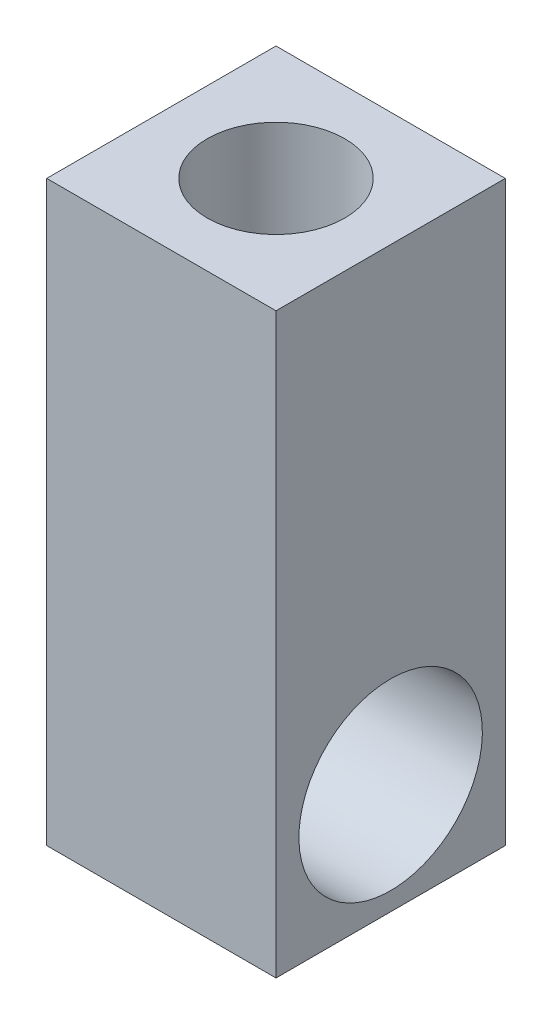
ISO-10303-21;
HEADER;
FILE_DESCRIPTION(('STEP AP214'),'2;1');
FILE_NAME('part.step','',(''),(''),'','','');
FILE_SCHEMA(('AUTOMOTIVE_DESIGN { 1 0 10303 214 1 1 1 1 }'));
ENDSEC;
DATA;
#1=APPLICATION_CONTEXT('core data for automotive mechanical design processes');
#2=APPLICATION_PROTOCOL_DEFINITION('international standard','automotive_design',2000,#1);
#3=PRODUCT_CONTEXT('',#1,'mechanical');
#4=PRODUCT('Part','Part','',(#3));
#5=PRODUCT_RELATED_PRODUCT_CATEGORY('part','',(#4));
#6=PRODUCT_DEFINITION_FORMATION('','',#4);
#7=PRODUCT_DEFINITION_CONTEXT('part definition',#1,'design');
#8=PRODUCT_DEFINITION('design','',#6,#7);
#9=PRODUCT_DEFINITION_SHAPE('','',#8);
#10=(LENGTH_UNIT() NAMED_UNIT(*) SI_UNIT(.MILLI.,.METRE.));
#11=(NAMED_UNIT(*) PLANE_ANGLE_UNIT() SI_UNIT($,.RADIAN.));
#12=(NAMED_UNIT(*) SI_UNIT($,.STERADIAN.) SOLID_ANGLE_UNIT());
#13=UNCERTAINTY_MEASURE_WITH_UNIT(LENGTH_MEASURE(1.E-05),#10,'distance_accuracy_value','');
#14=(GEOMETRIC_REPRESENTATION_CONTEXT(3) GLOBAL_UNCERTAINTY_ASSIGNED_CONTEXT((#13)) GLOBAL_UNIT_ASSIGNED_CONTEXT((#10,
#11,#12)) REPRESENTATION_CONTEXT('',''));
#15=CARTESIAN_POINT('',(0.,0.,0.));
#16=DIRECTION('',(0.,0.,1.));
#17=DIRECTION('',(1.,0.,0.));
#18=AXIS2_PLACEMENT_3D('',#15,#16,#17);
#19=CARTESIAN_POINT('',(0.,0.,0.));
#20=DIRECTION('',(0.,0.,1.));
#21=DIRECTION('',(1.,0.,0.));
#22=AXIS2_PLACEMENT_3D('',#19,#20,#21);
#23=PLANE('',#22);
#24=DIRECTION('',(0.,1.,0.));
#25=VECTOR('',#24,1.);
#26=CARTESIAN_POINT('',(1.25,5.,0.));
#27=LINE('',#26,#25);
#28=CARTESIAN_POINT('',(1.25,-4.3,0.));
#29=VERTEX_POINT('',#28);
#30=CARTESIAN_POINT('',(1.25,2.,0.));
#31=VERTEX_POINT('',#30);
#32=EDGE_CURVE('E169',#29,#31,#27,.T.);
#33=ORIENTED_EDGE('',*,*,#32,.F.);
#34=DIRECTION('',(1.,0.,0.));
#35=VECTOR('',#34,1.);
#36=CARTESIAN_POINT('',(-1.25,-4.3,0.));
#37=LINE('',#36,#35);
#38=CARTESIAN_POINT('',(-1.25,-4.3,0.));
#39=VERTEX_POINT('',#38);
#40=EDGE_CURVE('E101',#39,#29,#37,.T.);
#41=ORIENTED_EDGE('',*,*,#40,.F.);
#42=DIRECTION('',(0.,-1.,0.));
#43=VECTOR('',#42,1.);
#44=CARTESIAN_POINT('',(-1.25,5.,0.));
#45=LINE('',#44,#43);
#46=CARTESIAN_POINT('',(-1.25,2.,0.));
#47=VERTEX_POINT('',#46);
#48=EDGE_CURVE('E161',#47,#39,#45,.T.);
#49=ORIENTED_EDGE('',*,*,#48,.F.);
#50=DIRECTION('',(-1.,0.,0.));
#51=VECTOR('',#50,1.);
#52=CARTESIAN_POINT('',(-1.25,2.,0.));
#53=LINE('',#52,#51);
#54=EDGE_CURVE('E177',#31,#47,#53,.T.);
#55=ORIENTED_EDGE('',*,*,#54,.F.);
#56=EDGE_LOOP('',(#33,#41,#49,#55));
#57=FACE_BOUND('',#56,.T.);
#58=ADVANCED_FACE('F35',(#57),#23,.F.);
#59=CARTESIAN_POINT('',(0.,0.,2.5));
#60=DIRECTION('',(0.,0.,1.));
#61=DIRECTION('',(1.,0.,0.));
#62=AXIS2_PLACEMENT_3D('',#59,#60,#61);
#63=PLANE('',#62);
#64=DIRECTION('',(1.,0.,0.));
#65=VECTOR('',#64,1.);
#66=CARTESIAN_POINT('',(-1.25,-4.3,2.5));
#67=LINE('',#66,#65);
#68=CARTESIAN_POINT('',(-1.25,-4.3,2.5));
#69=VERTEX_POINT('',#68);
#70=CARTESIAN_POINT('',(1.25,-4.3,2.5));
#71=VERTEX_POINT('',#70);
#72=EDGE_CURVE('E96',#69,#71,#67,.T.);
#73=ORIENTED_EDGE('',*,*,#72,.T.);
#74=DIRECTION('',(0.,1.,0.));
#75=VECTOR('',#74,1.);
#76=CARTESIAN_POINT('',(1.25,5.,2.5));
#77=LINE('',#76,#75);
#78=CARTESIAN_POINT('',(1.25,2.,2.5));
#79=VERTEX_POINT('',#78);
#80=EDGE_CURVE('E168',#71,#79,#77,.T.);
#81=ORIENTED_EDGE('',*,*,#80,.T.);
#82=DIRECTION('',(1.,0.,0.));
#83=VECTOR('',#82,1.);
#84=CARTESIAN_POINT('',(1.25,2.,2.5));
#85=LINE('',#84,#83);
#86=CARTESIAN_POINT('',(-1.25,2.,2.5));
#87=VERTEX_POINT('',#86);
#88=EDGE_CURVE('E183',#87,#79,#85,.T.);
#89=ORIENTED_EDGE('',*,*,#88,.F.);
#90=DIRECTION('',(0.,-1.,0.));
#91=VECTOR('',#90,1.);
#92=CARTESIAN_POINT('',(-1.25,5.,2.5));
#93=LINE('',#92,#91);
#94=EDGE_CURVE('E88',#87,#69,#93,.T.);
#95=ORIENTED_EDGE('',*,*,#94,.T.);
#96=EDGE_LOOP('',(#73,#81,#89,#95));
#97=FACE_BOUND('',#96,.T.);
#98=ADVANCED_FACE('F140',(#97),#63,.T.);
#99=CARTESIAN_POINT('',(-1.25,5.,2.5));
#100=DIRECTION('',(1.,0.,0.));
#101=DIRECTION('',(0.,1.,0.));
#102=AXIS2_PLACEMENT_3D('',#99,#100,#101);
#103=PLANE('',#102);
#104=CARTESIAN_POINT('',(-1.25,-3.1,1.25));
#105=DIRECTION('',(1.,0.,0.));
#106=DIRECTION('',(0.,1.,0.));
#107=AXIS2_PLACEMENT_3D('',#104,#105,#106);
#108=CIRCLE('',#107,1.);
#109=CARTESIAN_POINT('',(-1.25,-2.1,1.25));
#110=VERTEX_POINT('',#109);
#111=EDGE_CURVE('E92',#110,#110,#108,.T.);
#112=ORIENTED_EDGE('',*,*,#111,.T.);
#113=EDGE_LOOP('',(#112));
#114=FACE_BOUND('',#113,.T.);
#115=ORIENTED_EDGE('',*,*,#48,.T.);
#116=DIRECTION('',(0.,0.,1.));
#117=VECTOR('',#116,1.);
#118=CARTESIAN_POINT('',(-1.25,-4.3,2.5));
#119=LINE('',#118,#117);
#120=EDGE_CURVE('E163',#39,#69,#119,.T.);
#121=ORIENTED_EDGE('',*,*,#120,.T.);
#122=ORIENTED_EDGE('',*,*,#94,.F.);
#123=DIRECTION('',(0.,0.,1.));
#124=VECTOR('',#123,1.);
#125=CARTESIAN_POINT('',(-1.25,2.,2.5));
#126=LINE('',#125,#124);
#127=EDGE_CURVE('E165',#47,#87,#126,.T.);
#128=ORIENTED_EDGE('',*,*,#127,.F.);
#129=EDGE_LOOP('',(#115,#121,#122,#128));
#130=FACE_BOUND('',#129,.T.);
#131=ADVANCED_FACE('F136',(#114,#130),#103,.F.);
#132=CARTESIAN_POINT('',(1.25,5.,2.5));
#133=DIRECTION('',(-1.,0.,0.));
#134=DIRECTION('',(0.,-1.,0.));
#135=AXIS2_PLACEMENT_3D('',#132,#133,#134);
#136=PLANE('',#135);
#137=CARTESIAN_POINT('',(1.25,-3.1,1.25));
#138=DIRECTION('',(1.,0.,0.));
#139=DIRECTION('',(0.,1.,0.));
#140=AXIS2_PLACEMENT_3D('',#137,#138,#139);
#141=CIRCLE('',#140,1.);
#142=CARTESIAN_POINT('',(1.25,-2.1,1.25));
#143=VERTEX_POINT('',#142);
#144=EDGE_CURVE('E202',#143,#143,#141,.T.);
#145=ORIENTED_EDGE('',*,*,#144,.F.);
#146=EDGE_LOOP('',(#145));
#147=FACE_BOUND('',#146,.T.);
#148=ORIENTED_EDGE('',*,*,#80,.F.);
#149=DIRECTION('',(0.,0.,1.));
#150=VECTOR('',#149,1.);
#151=CARTESIAN_POINT('',(1.25,-4.3,2.5));
#152=LINE('',#151,#150);
#153=EDGE_CURVE('E194',#29,#71,#152,.T.);
#154=ORIENTED_EDGE('',*,*,#153,.F.);
#155=ORIENTED_EDGE('',*,*,#32,.T.);
#156=DIRECTION('',(0.,0.,-1.));
#157=VECTOR('',#156,1.);
#158=CARTESIAN_POINT('',(1.25,2.,0.));
#159=LINE('',#158,#157);
#160=EDGE_CURVE('E180',#79,#31,#159,.T.);
#161=ORIENTED_EDGE('',*,*,#160,.F.);
#162=EDGE_LOOP('',(#148,#154,#155,#161));
#163=FACE_BOUND('',#162,.T.);
#164=ADVANCED_FACE('F37',(#147,#163),#136,.F.);
#165=CARTESIAN_POINT('',(0.,2.,0.));
#166=DIRECTION('',(0.,-1.,0.));
#167=DIRECTION('',(0.,0.,-1.));
#168=AXIS2_PLACEMENT_3D('',#165,#166,#167);
#169=PLANE('',#168);
#170=ORIENTED_EDGE('',*,*,#127,.T.);
#171=ORIENTED_EDGE('',*,*,#88,.T.);
#172=ORIENTED_EDGE('',*,*,#160,.T.);
#173=ORIENTED_EDGE('',*,*,#54,.T.);
#174=EDGE_LOOP('',(#170,#171,#172,#173));
#175=FACE_BOUND('',#174,.T.);
#176=CARTESIAN_POINT('',(0.,2.,1.25));
#177=DIRECTION('',(0.,-1.,0.));
#178=DIRECTION('',(0.,0.,-1.));
#179=AXIS2_PLACEMENT_3D('',#176,#177,#178);
#180=CIRCLE('',#179,0.75);
#181=CARTESIAN_POINT('',(0.,2.,0.5));
#182=VERTEX_POINT('',#181);
#183=EDGE_CURVE('E172',#182,#182,#180,.F.);
#184=ORIENTED_EDGE('',*,*,#183,.F.);
#185=EDGE_LOOP('',(#184));
#186=FACE_BOUND('',#185,.T.);
#187=ADVANCED_FACE('F126',(#175,#186),#169,.F.);
#188=CARTESIAN_POINT('',(0.,2.,1.25));
#189=DIRECTION('',(0.,1.,0.));
#190=DIRECTION('',(0.,0.,1.));
#191=AXIS2_PLACEMENT_3D('',#188,#189,#190);
#192=CYLINDRICAL_SURFACE('',#191,0.75);
#193=CARTESIAN_POINT('',(0.,-0.738562172233855,2.));
#194=CARTESIAN_POINT('',(0.0349987117125832,-0.738554049778856,1.99999609524743));
#195=CARTESIAN_POINT('',(0.0700229171549386,-0.735718166919958,1.99752054537294));
#196=CARTESIAN_POINT('',(0.138664928105764,-0.725046779838966,1.9878916660512));
#197=CARTESIAN_POINT('',(0.172278222513622,-0.717196374167874,1.98072439282475));
#198=CARTESIAN_POINT('',(0.236789923365375,-0.698124360404582,1.96241919496237));
#199=CARTESIAN_POINT('',(0.267719388367077,-0.686950758734853,1.95133741723644));
#200=CARTESIAN_POINT('',(0.327172727236751,-0.662567724884742,1.92565327648516));
#201=CARTESIAN_POINT('',(0.355696891287409,-0.649358538828566,1.91105133896496));
#202=CARTESIAN_POINT('',(0.41605639809357,-0.619113435009391,1.87519954910839));
#203=CARTESIAN_POINT('',(0.447333966850117,-0.601855479193177,1.85319786996837));
#204=CARTESIAN_POINT('',(0.506262732850758,-0.567394178738678,1.80466798401951));
#205=CARTESIAN_POINT('',(0.533908482331259,-0.550190953074335,1.77813311147922));
#206=CARTESIAN_POINT('',(0.590429369421723,-0.51368708809188,1.71480509604883));
#207=CARTESIAN_POINT('',(0.618402983384786,-0.494675393923448,1.6770236445506));
#208=CARTESIAN_POINT('',(0.667311104116619,-0.460585951169777,1.5955948574314));
#209=CARTESIAN_POINT('',(0.688262148728871,-0.445498979083387,1.55196164692264));
#210=CARTESIAN_POINT('',(0.716603842955338,-0.424828705059998,1.47393451198864));
#211=CARTESIAN_POINT('',(0.72617854799027,-0.417751445397981,1.44072302484541));
#212=CARTESIAN_POINT('',(0.740695057997339,-0.406971820309223,1.37277630465912));
#213=CARTESIAN_POINT('',(0.745640888053093,-0.403266522837378,1.33804242299781));
#214=CARTESIAN_POINT('',(0.750610866931524,-0.399543122110379,1.26793254631078));
#215=CARTESIAN_POINT('',(0.750622227188294,-0.399534599712743,1.23255512044062));
#216=CARTESIAN_POINT('',(0.745691031609782,-0.403228967484458,1.16234192166304));
#217=CARTESIAN_POINT('',(0.740747328545908,-0.40693271714326,1.1275062760889));
#218=CARTESIAN_POINT('',(0.726459474705085,-0.417543110278003,1.06055540310366));
#219=CARTESIAN_POINT('',(0.717271836806468,-0.424335711171619,1.02838786588185));
#220=CARTESIAN_POINT('',(0.695002178908877,-0.440588606714906,0.966159757476806));
#221=CARTESIAN_POINT('',(0.681919309743419,-0.450049483029033,0.936099647483183));
#222=CARTESIAN_POINT('',(0.650735192427344,-0.472194770077487,0.875391539067634));
#223=CARTESIAN_POINT('',(0.632243951690621,-0.485117296959519,0.8450323076432));
#224=CARTESIAN_POINT('',(0.591633148014743,-0.512696487581309,0.787716374725858));
#225=CARTESIAN_POINT('',(0.569510493150051,-0.527354626097737,0.76076260768939));
#226=CARTESIAN_POINT('',(0.517388325589529,-0.560531170638206,0.705458978583356));
#227=CARTESIAN_POINT('',(0.486695394986801,-0.579241720668164,0.677877534976079));
#228=CARTESIAN_POINT('',(0.421082708189028,-0.616370208581157,0.627995622218862));
#229=CARTESIAN_POINT('',(0.386160950237469,-0.634788003182387,0.605697668942616));
#230=CARTESIAN_POINT('',(0.319509064877186,-0.665902870004208,0.570633967941997));
#231=CARTESIAN_POINT('',(0.288506477349675,-0.679012001050091,0.556855665659488));
#232=CARTESIAN_POINT('',(0.223967359290309,-0.702316293713035,0.533403014456081));
#233=CARTESIAN_POINT('',(0.190436760154817,-0.712518023397448,0.523719390958706));
#234=CARTESIAN_POINT('',(0.128156528000839,-0.726799746898844,0.510488073246653));
#235=CARTESIAN_POINT('',(0.0997764589415701,-0.731692302215654,0.506104652517092));
#236=CARTESIAN_POINT('',(0.0423222669130873,-0.737822057808335,0.500641196901055));
#237=CARTESIAN_POINT('',(0.0132490800485899,-0.739063934708468,0.499556935633673));
#238=CARTESIAN_POINT('',(-0.0447394958666983,-0.737685656047519,0.500773649422242));
#239=CARTESIAN_POINT('',(-0.0736548229048357,-0.735064078964185,0.503075870502549));
#240=CARTESIAN_POINT('',(-0.130538076221435,-0.726393906124774,0.510887363640153));
#241=CARTESIAN_POINT('',(-0.15850429897405,-0.720339461363278,0.516402109718029));
#242=CARTESIAN_POINT('',(-0.223169022469434,-0.702861208560995,0.532930202188066));
#243=CARTESIAN_POINT('',(-0.259217976957514,-0.690275881513429,0.545229051153791));
#244=CARTESIAN_POINT('',(-0.328153831820057,-0.662310694600128,0.574555610807824));
#245=CARTESIAN_POINT('',(-0.361034758647373,-0.646925707613855,0.591592028322616));
#246=CARTESIAN_POINT('',(-0.42467450402406,-0.614458588121757,0.63065112941652));
#247=CARTESIAN_POINT('',(-0.455316438109127,-0.597335580769777,0.652829449698293));
#248=CARTESIAN_POINT('',(-0.513001048180623,-0.5632624686382,0.701587185427038));
#249=CARTESIAN_POINT('',(-0.540041963994467,-0.54631245212668,0.728168739027683));
#250=CARTESIAN_POINT('',(-0.595638495814682,-0.510198886882342,0.791882743085189));
#251=CARTESIAN_POINT('',(-0.623237619428797,-0.491359129173222,0.830051864526571));
#252=CARTESIAN_POINT('',(-0.671310366725435,-0.457734476150877,0.912224193674366));
#253=CARTESIAN_POINT('',(-0.691799412290646,-0.442940819738587,0.956214485012574));
#254=CARTESIAN_POINT('',(-0.719218995723433,-0.422902967988107,1.03462216925154));
#255=CARTESIAN_POINT('',(-0.72837839663772,-0.416122609851806,1.06787497133626));
#256=CARTESIAN_POINT('',(-0.742064398153761,-0.40594867205439,1.13581776751782));
#257=CARTESIAN_POINT('',(-0.746595140774254,-0.402552064465205,1.17050644771903));
#258=CARTESIAN_POINT('',(-0.750758195464302,-0.399432166414692,1.2404261970298));
#259=CARTESIAN_POINT('',(-0.750379008674122,-0.39971749890547,1.27565834629354));
#260=CARTESIAN_POINT('',(-0.744719504349381,-0.403955983780953,1.34550450551504));
#261=CARTESIAN_POINT('',(-0.739437881146261,-0.40791011327825,1.38011834829564));
#262=CARTESIAN_POINT('',(-0.72451254191638,-0.418982995374028,1.44676096762749));
#263=CARTESIAN_POINT('',(-0.714999909339224,-0.42600654603561,1.47883561825572));
#264=CARTESIAN_POINT('',(-0.69210596719053,-0.442686397124323,1.54083067154869));
#265=CARTESIAN_POINT('',(-0.678723830084543,-0.452343260688072,1.57075061169441));
#266=CARTESIAN_POINT('',(-0.646861031202017,-0.474911788946801,1.63127384938341));
#267=CARTESIAN_POINT('',(-0.627974534320207,-0.488068236462099,1.66157061835671));
#268=CARTESIAN_POINT('',(-0.586566779722894,-0.51607246962142,1.71870740586211));
#269=CARTESIAN_POINT('',(-0.564042181356975,-0.530921806021714,1.74554420619169));
#270=CARTESIAN_POINT('',(-0.510997316719604,-0.564468234789472,1.80056190330341));
#271=CARTESIAN_POINT('',(-0.479776800280048,-0.583345387476516,1.82795845770998));
#272=CARTESIAN_POINT('',(-0.413065964050062,-0.620669587683344,1.87737626714675));
#273=CARTESIAN_POINT('',(-0.377574086981716,-0.63911647539055,1.89939555278364));
#274=CARTESIAN_POINT('',(-0.310558374704849,-0.669751992753576,1.93347985650727));
#275=CARTESIAN_POINT('',(-0.279832508646727,-0.682431874961804,1.94666763169));
#276=CARTESIAN_POINT('',(-0.215958543472054,-0.704837176743856,1.96902699014299));
#277=CARTESIAN_POINT('',(-0.182817154202254,-0.71457042050158,1.9782092383917));
#278=CARTESIAN_POINT('',(-0.124605890201548,-0.727337883083653,1.98998528878191));
#279=CARTESIAN_POINT('',(-0.100016464354812,-0.731499348671474,1.99372124513437));
#280=CARTESIAN_POINT('',(-0.0502888334831273,-0.737113523037861,1.9987291953622));
#281=CARTESIAN_POINT('',(-0.02515099952797,-0.738568009244759,2.00000280605843));
#282=CARTESIAN_POINT('',(0.,-0.738562172233855,2.));
#283=B_SPLINE_CURVE_WITH_KNOTS('',3,(#193,#194,#195,#196,#197,#198,#199,#200,#201,#202,#203,
#204,#205,#206,#207,#208,#209,#210,#211,#212,#213,#214,#215,#216,#217,#218,#219,#220,#221,#222,
#223,#224,#225,#226,#227,#228,#229,#230,#231,#232,#233,#234,#235,#236,#237,#238,#239,#240,#241,
#242,#243,#244,#245,#246,#247,#248,#249,#250,#251,#252,#253,#254,#255,#256,#257,#258,#259,#260,
#261,#262,#263,#264,#265,#266,#267,#268,#269,#270,#271,#272,#273,#274,#275,#276,#277,#278,#279,
#280,#281,#282),.UNSPECIFIED.,.T.,.F.,(4,2,2,2,2,2,2,2,2,2,2,2,2,2,2,2,2,2,2,2,2,2,2,2,2,2,2,2,
2,2,2,2,2,2,2,2,2,2,2,2,2,2,2,2,4),(0.,0.104865888342245,0.210044861291497,0.31377269281007,
0.417487992336173,0.542926043452542,0.668550155159985,0.819824240518429,0.970739537225555,
1.07613862638851,1.18144597935429,1.28702625363977,1.39263097820718,1.49461877947599,
1.59662883054408,1.70968422058521,1.82283637443905,1.95824758602425,2.0937231482404,
2.20249704738672,2.31102323306577,2.39804002773024,2.4849453026917,2.5718825616318,
2.65896839348083,2.77865014101273,2.89855331319649,3.02271604545104,3.14693924723383,
3.29826249755805,3.44925544293356,3.55426448097287,3.65917946769664,3.76434020550596,
3.86952895887046,3.9716640634603,4.0738210268974,4.18755026244879,4.30138452872396,
4.43773790289151,4.57414114104339,4.68109139820492,4.78775512886423,4.86316406036957,
4.93852346016279),.UNSPECIFIED.);
#284=CARTESIAN_POINT('',(0.,-0.738562172233855,2.));
#285=VERTEX_POINT('',#284);
#286=EDGE_CURVE('E99',#285,#285,#283,.T.);
#287=ORIENTED_EDGE('',*,*,#286,.F.);
#288=EDGE_LOOP('',(#287));
#289=FACE_BOUND('',#288,.T.);
#290=ORIENTED_EDGE('',*,*,#183,.T.);
#291=EDGE_LOOP('',(#290));
#292=FACE_BOUND('',#291,.T.);
#293=ADVANCED_FACE('F114',(#289,#292),#192,.F.);
#294=CARTESIAN_POINT('',(-1.25,-1.4,1.25));
#295=DIRECTION('',(1.,0.,0.));
#296=DIRECTION('',(0.,1.,0.));
#297=AXIS2_PLACEMENT_3D('',#294,#295,#296);
#298=CYLINDRICAL_SURFACE('',#297,1.);
#299=ORIENTED_EDGE('',*,*,#286,.T.);
#300=EDGE_LOOP('',(#299));
#301=FACE_BOUND('',#300,.T.);
#302=ADVANCED_FACE('F118',(#301),#298,.T.);
#303=CARTESIAN_POINT('',(-1.25,-4.3,2.5));
#304=DIRECTION('',(0.,1.,0.));
#305=DIRECTION('',(-1.,0.,0.));
#306=AXIS2_PLACEMENT_3D('',#303,#304,#305);
#307=PLANE('',#306);
#308=ORIENTED_EDGE('',*,*,#153,.T.);
#309=ORIENTED_EDGE('',*,*,#72,.F.);
#310=ORIENTED_EDGE('',*,*,#120,.F.);
#311=ORIENTED_EDGE('',*,*,#40,.T.);
#312=EDGE_LOOP('',(#308,#309,#310,#311));
#313=FACE_BOUND('',#312,.T.);
#314=ADVANCED_FACE('F122',(#313),#307,.F.);
#315=CARTESIAN_POINT('',(-1.25,-3.1,1.25));
#316=DIRECTION('',(1.,0.,0.));
#317=DIRECTION('',(0.,1.,0.));
#318=AXIS2_PLACEMENT_3D('',#315,#316,#317);
#319=CYLINDRICAL_SURFACE('',#318,1.);
#320=ORIENTED_EDGE('',*,*,#111,.F.);
#321=EDGE_LOOP('',(#320));
#322=FACE_BOUND('',#321,.T.);
#323=ORIENTED_EDGE('',*,*,#144,.T.);
#324=EDGE_LOOP('',(#323));
#325=FACE_BOUND('',#324,.T.);
#326=DIRECTION('',(1.,0.,0.));
#327=VECTOR('',#326,1.);
#328=CARTESIAN_POINT('',(0.,-2.25,1.77678268764264));
#329=LINE('',#328,#327);
#330=CARTESIAN_POINT('',(-0.533853912601561,-2.25,1.77678268764264));
#331=VERTEX_POINT('',#330);
#332=CARTESIAN_POINT('',(0.533853912601561,-2.25,1.77678268764264));
#333=VERTEX_POINT('',#332);
#334=EDGE_CURVE('E43',#331,#333,#329,.T.);
#335=ORIENTED_EDGE('',*,*,#334,.F.);
#336=CARTESIAN_POINT('',(0.,-2.43856217223385,2.));
#337=CARTESIAN_POINT('',(-0.0349987117125829,-2.43855404977885,1.99999609524743));
#338=CARTESIAN_POINT('',(-0.0700229171549382,-2.43571816691995,1.99752054537294));
#339=CARTESIAN_POINT('',(-0.138664928105763,-2.42504677983896,1.9878916660512));
#340=CARTESIAN_POINT('',(-0.172278222513622,-2.41719637416787,1.98072439282475));
#341=CARTESIAN_POINT('',(-0.236789923365374,-2.39812436040458,1.96241919496237));
#342=CARTESIAN_POINT('',(-0.267719388367076,-2.38695075873485,1.95133741723644));
#343=CARTESIAN_POINT('',(-0.327172727236751,-2.36256772488474,1.92565327648516));
#344=CARTESIAN_POINT('',(-0.355696891287408,-2.34935853882856,1.91105133896496));
#345=CARTESIAN_POINT('',(-0.41605639809357,-2.31911343500939,1.87519954910839));
#346=CARTESIAN_POINT('',(-0.447333966850117,-2.30185547919317,1.85319786996837));
#347=CARTESIAN_POINT('',(-0.506262732850757,-2.26739417873867,1.80466798401951));
#348=CARTESIAN_POINT('',(-0.533908482331259,-2.25019095307433,1.77813311147922));
#349=CARTESIAN_POINT('',(-0.590429369421723,-2.21368708809188,1.71480509604883));
#350=CARTESIAN_POINT('',(-0.618402983384786,-2.19467539392344,1.6770236445506));
#351=CARTESIAN_POINT('',(-0.667311104116619,-2.16058595116977,1.5955948574314));
#352=CARTESIAN_POINT('',(-0.68826214872887,-2.14549897908338,1.55196164692264));
#353=CARTESIAN_POINT('',(-0.716603842955337,-2.12482870505999,1.47393451198864));
#354=CARTESIAN_POINT('',(-0.726178547990269,-2.11775144539798,1.44072302484541));
#355=CARTESIAN_POINT('',(-0.740695057997339,-2.10697182030922,1.37277630465912));
#356=CARTESIAN_POINT('',(-0.745640888053092,-2.10326652283737,1.33804242299781));
#357=CARTESIAN_POINT('',(-0.750610866931524,-2.09954312211037,1.26793254631078));
#358=CARTESIAN_POINT('',(-0.750622227188294,-2.09953459971274,1.23255512044062));
#359=CARTESIAN_POINT('',(-0.745691031609782,-2.10322896748445,1.16234192166304));
#360=CARTESIAN_POINT('',(-0.740747328545908,-2.10693271714326,1.1275062760889));
#361=CARTESIAN_POINT('',(-0.726459474705085,-2.117543110278,1.06055540310366));
#362=CARTESIAN_POINT('',(-0.717271836806467,-2.12433571117161,1.02838786588185));
#363=CARTESIAN_POINT('',(-0.695002178908877,-2.1405886067149,0.966159757476806));
#364=CARTESIAN_POINT('',(-0.681919309743418,-2.15004948302903,0.936099647483183));
#365=CARTESIAN_POINT('',(-0.650735192427344,-2.17219477007748,0.875391539067633));
#366=CARTESIAN_POINT('',(-0.632243951690621,-2.18511729695952,0.8450323076432));
#367=CARTESIAN_POINT('',(-0.591633148014742,-2.2126964875813,0.787716374725858));
#368=CARTESIAN_POINT('',(-0.569510493150051,-2.22735462609773,0.760762607689389));
#369=CARTESIAN_POINT('',(-0.517388325589529,-2.2605311706382,0.705458978583356));
#370=CARTESIAN_POINT('',(-0.486695394986801,-2.27924172066816,0.677877534976079));
#371=CARTESIAN_POINT('',(-0.421082708189028,-2.31637020858115,0.627995622218861));
#372=CARTESIAN_POINT('',(-0.386160950237468,-2.33478800318238,0.605697668942616));
#373=CARTESIAN_POINT('',(-0.319509064877186,-2.3659028700042,0.570633967941997));
#374=CARTESIAN_POINT('',(-0.288506477349674,-2.37901200105009,0.556855665659487));
#375=CARTESIAN_POINT('',(-0.223967359290309,-2.40231629371303,0.533403014456081));
#376=CARTESIAN_POINT('',(-0.190436760154816,-2.41251802339744,0.523719390958706));
#377=CARTESIAN_POINT('',(-0.128156528000839,-2.42679974689884,0.510488073246653));
#378=CARTESIAN_POINT('',(-0.0997764589415697,-2.43169230221565,0.506104652517092));
#379=CARTESIAN_POINT('',(-0.0423222669130869,-2.43782205780833,0.500641196901055));
#380=CARTESIAN_POINT('',(-0.0132490800485895,-2.43906393470846,0.499556935633673));
#381=CARTESIAN_POINT('',(0.0447394958666988,-2.43768565604751,0.500773649422242));
#382=CARTESIAN_POINT('',(0.0736548229048361,-2.43506407896418,0.503075870502549));
#383=CARTESIAN_POINT('',(0.130538076221436,-2.42639390612477,0.510887363640153));
#384=CARTESIAN_POINT('',(0.158504298974051,-2.42033946136327,0.516402109718029));
#385=CARTESIAN_POINT('',(0.223169022469435,-2.40286120856099,0.532930202188066));
#386=CARTESIAN_POINT('',(0.259217976957514,-2.39027588151342,0.545229051153791));
#387=CARTESIAN_POINT('',(0.328153831820058,-2.36231069460012,0.574555610807824));
#388=CARTESIAN_POINT('',(0.361034758647374,-2.34692570761385,0.591592028322616));
#389=CARTESIAN_POINT('',(0.42467450402406,-2.31445858812175,0.63065112941652));
#390=CARTESIAN_POINT('',(0.455316438109128,-2.29733558076977,0.652829449698293));
#391=CARTESIAN_POINT('',(0.513001048180623,-2.2632624686382,0.701587185427038));
#392=CARTESIAN_POINT('',(0.540041963994468,-2.24631245212668,0.728168739027683));
#393=CARTESIAN_POINT('',(0.595638495814682,-2.21019888688234,0.791882743085189));
#394=CARTESIAN_POINT('',(0.623237619428798,-2.19135912917322,0.830051864526572));
#395=CARTESIAN_POINT('',(0.671310366725436,-2.15773447615087,0.912224193674366));
#396=CARTESIAN_POINT('',(0.691799412290646,-2.14294081973858,0.956214485012574));
#397=CARTESIAN_POINT('',(0.719218995723433,-2.1229029679881,1.03462216925154));
#398=CARTESIAN_POINT('',(0.72837839663772,-2.1161226098518,1.06787497133626));
#399=CARTESIAN_POINT('',(0.742064398153761,-2.10594867205438,1.13581776751782));
#400=CARTESIAN_POINT('',(0.746595140774254,-2.1025520644652,1.17050644771903));
#401=CARTESIAN_POINT('',(0.750758195464302,-2.09943216641469,1.2404261970298));
#402=CARTESIAN_POINT('',(0.750379008674123,-2.09971749890546,1.27565834629354));
#403=CARTESIAN_POINT('',(0.744719504349381,-2.10395598378095,1.34550450551504));
#404=CARTESIAN_POINT('',(0.739437881146261,-2.10791011327824,1.38011834829564));
#405=CARTESIAN_POINT('',(0.72451254191638,-2.11898299537402,1.44676096762749));
#406=CARTESIAN_POINT('',(0.714999909339225,-2.1260065460356,1.47883561825572));
#407=CARTESIAN_POINT('',(0.69210596719053,-2.14268639712432,1.54083067154869));
#408=CARTESIAN_POINT('',(0.678723830084543,-2.15234326068807,1.57075061169441));
#409=CARTESIAN_POINT('',(0.646861031202017,-2.1749117889468,1.63127384938341));
#410=CARTESIAN_POINT('',(0.627974534320207,-2.18806823646209,1.66157061835671));
#411=CARTESIAN_POINT('',(0.586566779722894,-2.21607246962142,1.71870740586211));
#412=CARTESIAN_POINT('',(0.564042181356975,-2.23092180602171,1.74554420619169));
#413=CARTESIAN_POINT('',(0.510997316719604,-2.26446823478947,1.80056190330341));
#414=CARTESIAN_POINT('',(0.479776800280049,-2.28334538747651,1.82795845770998));
#415=CARTESIAN_POINT('',(0.413065964050063,-2.32066958768334,1.87737626714675));
#416=CARTESIAN_POINT('',(0.377574086981717,-2.33911647539055,1.89939555278364));
#417=CARTESIAN_POINT('',(0.310558374704849,-2.36975199275357,1.93347985650727));
#418=CARTESIAN_POINT('',(0.279832508646727,-2.3824318749618,1.94666763169));
#419=CARTESIAN_POINT('',(0.215958543472055,-2.40483717674385,1.96902699014299));
#420=CARTESIAN_POINT('',(0.182817154202255,-2.41457042050158,1.9782092383917));
#421=CARTESIAN_POINT('',(0.124605890201549,-2.42733788308365,1.98998528878191));
#422=CARTESIAN_POINT('',(0.100016464354813,-2.43149934867147,1.99372124513437));
#423=CARTESIAN_POINT('',(0.0502888334831283,-2.43711352303786,1.9987291953622));
#424=CARTESIAN_POINT('',(0.0251509995279707,-2.43856800924475,2.00000280605843));
#425=CARTESIAN_POINT('',(0.,-2.43856217223385,2.));
#426=B_SPLINE_CURVE_WITH_KNOTS('',3,(#336,#337,#338,#339,#340,#341,#342,#343,#344,#345,#346,
#347,#348,#349,#350,#351,#352,#353,#354,#355,#356,#357,#358,#359,#360,#361,#362,#363,#364,#365,
#366,#367,#368,#369,#370,#371,#372,#373,#374,#375,#376,#377,#378,#379,#380,#381,#382,#383,#384,
#385,#386,#387,#388,#389,#390,#391,#392,#393,#394,#395,#396,#397,#398,#399,#400,#401,#402,#403,
#404,#405,#406,#407,#408,#409,#410,#411,#412,#413,#414,#415,#416,#417,#418,#419,#420,#421,#422,
#423,#424,#425),.UNSPECIFIED.,.T.,.F.,(4,2,2,2,2,2,2,2,2,2,2,2,2,2,2,2,2,2,2,2,2,2,2,2,2,2,2,2,
2,2,2,2,2,2,2,2,2,2,2,2,2,2,2,2,4),(0.,0.104865888342245,0.210044861291497,0.31377269281007,
0.417487992336173,0.542926043452542,0.668550155159984,0.819824240518429,0.970739537225554,
1.07613862638851,1.18144597935429,1.28702625363977,1.39263097820718,1.49461877947599,
1.59662883054408,1.70968422058521,1.82283637443905,1.95824758602425,2.0937231482404,
2.20249704738672,2.31102323306577,2.39804002773024,2.4849453026917,2.5718825616318,
2.65896839348083,2.77865014101273,2.89855331319649,3.02271604545104,3.14693924723383,
3.29826249755805,3.44925544293356,3.55426448097287,3.65917946769664,3.76434020550596,
3.86952895887046,3.9716640634603,4.0738210268974,4.18755026244879,4.30138452872396,
4.43773790289151,4.57414114104339,4.68109139820491,4.78775512886423,4.86316406036957,
4.93852346016279),.UNSPECIFIED.);
#427=EDGE_CURVE('E49',#333,#331,#426,.T.);
#428=ORIENTED_EDGE('',*,*,#427,.F.);
#429=EDGE_LOOP('',(#335,#428));
#430=FACE_BOUND('',#429,.T.);
#431=DIRECTION('',(1.,0.,0.));
#432=VECTOR('',#431,1.);
#433=CARTESIAN_POINT('',(0.,-2.25,0.72321731235736));
#434=LINE('',#433,#432);
#435=CARTESIAN_POINT('',(0.533853912601563,-2.25,0.72321731235736));
#436=VERTEX_POINT('',#435);
#437=CARTESIAN_POINT('',(-0.533853912601562,-2.25,0.72321731235736));
#438=VERTEX_POINT('',#437);
#439=EDGE_CURVE('E11',#436,#438,#434,.F.);
#440=ORIENTED_EDGE('',*,*,#439,.F.);
#441=EDGE_CURVE('E56',#438,#436,#426,.T.);
#442=ORIENTED_EDGE('',*,*,#441,.F.);
#443=EDGE_LOOP('',(#440,#442));
#444=FACE_BOUND('',#443,.T.);
#445=ADVANCED_FACE('F84',(#322,#325,#430,#444),#319,.F.);
#446=CARTESIAN_POINT('',(0.,-2.06143782776615,2.));
#447=CARTESIAN_POINT('',(-0.0349987117125829,-2.06144595022115,1.99999609524743));
#448=CARTESIAN_POINT('',(-0.0700229171549382,-2.06428183308005,1.99752054537294));
#449=CARTESIAN_POINT('',(-0.138664928105763,-2.07495322016104,1.9878916660512));
#450=CARTESIAN_POINT('',(-0.172278222513622,-2.08280362583213,1.98072439282475));
#451=CARTESIAN_POINT('',(-0.236789923365374,-2.10187563959543,1.96241919496237));
#452=CARTESIAN_POINT('',(-0.267719388367077,-2.11304924126516,1.95133741723644));
#453=CARTESIAN_POINT('',(-0.327172727236751,-2.13743227511527,1.92565327648516));
#454=CARTESIAN_POINT('',(-0.355696891287408,-2.15064146117144,1.91105133896496));
#455=CARTESIAN_POINT('',(-0.416056398093569,-2.18088656499062,1.87519954910839));
#456=CARTESIAN_POINT('',(-0.447333966850117,-2.19814452080683,1.85319786996837));
#457=CARTESIAN_POINT('',(-0.506262732850758,-2.23260582126133,1.80466798401951));
#458=CARTESIAN_POINT('',(-0.533908482331259,-2.24980904692567,1.77813311147922));
#459=CARTESIAN_POINT('',(-0.590429369421723,-2.28631291190813,1.71480509604883));
#460=CARTESIAN_POINT('',(-0.618402983384786,-2.30532460607656,1.6770236445506));
#461=CARTESIAN_POINT('',(-0.667311104116619,-2.33941404883023,1.5955948574314));
#462=CARTESIAN_POINT('',(-0.688262148728871,-2.35450102091662,1.55196164692264));
#463=CARTESIAN_POINT('',(-0.716603842955338,-2.37517129494001,1.47393451198864));
#464=CARTESIAN_POINT('',(-0.726178547990269,-2.38224855460203,1.44072302484541));
#465=CARTESIAN_POINT('',(-0.740695057997339,-2.39302817969079,1.37277630465912));
#466=CARTESIAN_POINT('',(-0.745640888053092,-2.39673347716263,1.33804242299781));
#467=CARTESIAN_POINT('',(-0.750610866931524,-2.40045687788963,1.26793254631078));
#468=CARTESIAN_POINT('',(-0.750622227188294,-2.40046540028727,1.23255512044062));
#469=CARTESIAN_POINT('',(-0.745691031609782,-2.39677103251555,1.16234192166304));
#470=CARTESIAN_POINT('',(-0.740747328545908,-2.39306728285675,1.1275062760889));
#471=CARTESIAN_POINT('',(-0.726459474705084,-2.382456889722,1.06055540310366));
#472=CARTESIAN_POINT('',(-0.717271836806467,-2.37566428882839,1.02838786588185));
#473=CARTESIAN_POINT('',(-0.695002178908877,-2.3594113932851,0.966159757476805));
#474=CARTESIAN_POINT('',(-0.681919309743418,-2.34995051697098,0.936099647483183));
#475=CARTESIAN_POINT('',(-0.650735192427344,-2.32780522992252,0.875391539067633));
#476=CARTESIAN_POINT('',(-0.632243951690621,-2.31488270304049,0.8450323076432));
#477=CARTESIAN_POINT('',(-0.591633148014742,-2.2873035124187,0.787716374725858));
#478=CARTESIAN_POINT('',(-0.56951049315005,-2.27264537390227,0.760762607689389));
#479=CARTESIAN_POINT('',(-0.517388325589528,-2.2394688293618,0.705458978583356));
#480=CARTESIAN_POINT('',(-0.486695394986801,-2.22075827933184,0.677877534976078));
#481=CARTESIAN_POINT('',(-0.421082708189027,-2.18362979141885,0.627995622218861));
#482=CARTESIAN_POINT('',(-0.386160950237468,-2.16521199681762,0.605697668942615));
#483=CARTESIAN_POINT('',(-0.319509064877185,-2.1340971299958,0.570633967941997));
#484=CARTESIAN_POINT('',(-0.288506477349674,-2.12098799894992,0.556855665659487));
#485=CARTESIAN_POINT('',(-0.223967359290308,-2.09768370628697,0.53340301445608));
#486=CARTESIAN_POINT('',(-0.190436760154816,-2.08748197660256,0.523719390958706));
#487=CARTESIAN_POINT('',(-0.128156528000838,-2.07320025310116,0.510488073246653));
#488=CARTESIAN_POINT('',(-0.0997764589415692,-2.06830769778435,0.506104652517092));
#489=CARTESIAN_POINT('',(-0.0423222669130864,-2.06217794219167,0.500641196901055));
#490=CARTESIAN_POINT('',(-0.013249080048589,-2.06093606529154,0.499556935633672));
#491=CARTESIAN_POINT('',(0.0447394958666993,-2.06231434395249,0.500773649422242));
#492=CARTESIAN_POINT('',(0.0736548229048366,-2.06493592103582,0.503075870502549));
#493=CARTESIAN_POINT('',(0.130538076221436,-2.07360609387523,0.510887363640153));
#494=CARTESIAN_POINT('',(0.158504298974051,-2.07966053863673,0.516402109718029));
#495=CARTESIAN_POINT('',(0.223169022469435,-2.09713879143901,0.532930202188066));
#496=CARTESIAN_POINT('',(0.259217976957515,-2.10972411848658,0.545229051153791));
#497=CARTESIAN_POINT('',(0.328153831820058,-2.13768930539988,0.574555610807825));
#498=CARTESIAN_POINT('',(0.361034758647374,-2.15307429238615,0.591592028322617));
#499=CARTESIAN_POINT('',(0.42467450402406,-2.18554141187825,0.63065112941652));
#500=CARTESIAN_POINT('',(0.455316438109128,-2.20266441923023,0.652829449698293));
#501=CARTESIAN_POINT('',(0.513001048180623,-2.23673753136181,0.701587185427038));
#502=CARTESIAN_POINT('',(0.540041963994468,-2.25368754787333,0.728168739027683));
#503=CARTESIAN_POINT('',(0.595638495814682,-2.28980111311767,0.791882743085189));
#504=CARTESIAN_POINT('',(0.623237619428798,-2.30864087082679,0.830051864526572));
#505=CARTESIAN_POINT('',(0.671310366725435,-2.34226552384913,0.912224193674366));
#506=CARTESIAN_POINT('',(0.691799412290646,-2.35705918026142,0.956214485012574));
#507=CARTESIAN_POINT('',(0.719218995723433,-2.3770970320119,1.03462216925154));
#508=CARTESIAN_POINT('',(0.72837839663772,-2.3838773901482,1.06787497133626));
#509=CARTESIAN_POINT('',(0.742064398153761,-2.39405132794562,1.13581776751782));
#510=CARTESIAN_POINT('',(0.746595140774254,-2.3974479355348,1.17050644771903));
#511=CARTESIAN_POINT('',(0.750758195464302,-2.40056783358532,1.2404261970298));
#512=CARTESIAN_POINT('',(0.750379008674123,-2.40028250109454,1.27565834629354));
#513=CARTESIAN_POINT('',(0.744719504349381,-2.39604401621906,1.34550450551504));
#514=CARTESIAN_POINT('',(0.739437881146261,-2.39208988672176,1.38011834829564));
#515=CARTESIAN_POINT('',(0.72451254191638,-2.38101700462598,1.44676096762749));
#516=CARTESIAN_POINT('',(0.714999909339225,-2.3739934539644,1.47883561825572));
#517=CARTESIAN_POINT('',(0.69210596719053,-2.35731360287569,1.54083067154869));
#518=CARTESIAN_POINT('',(0.678723830084543,-2.34765673931194,1.57075061169441));
#519=CARTESIAN_POINT('',(0.646861031202017,-2.32508821105321,1.63127384938341));
#520=CARTESIAN_POINT('',(0.627974534320207,-2.31193176353791,1.66157061835671));
#521=CARTESIAN_POINT('',(0.586566779722894,-2.28392753037859,1.71870740586211));
#522=CARTESIAN_POINT('',(0.564042181356975,-2.26907819397829,1.74554420619169));
#523=CARTESIAN_POINT('',(0.510997316719604,-2.23553176521054,1.80056190330341));
#524=CARTESIAN_POINT('',(0.479776800280049,-2.21665461252349,1.82795845770998));
#525=CARTESIAN_POINT('',(0.413065964050062,-2.17933041231666,1.87737626714675));
#526=CARTESIAN_POINT('',(0.377574086981716,-2.16088352460946,1.89939555278364));
#527=CARTESIAN_POINT('',(0.310558374704848,-2.13024800724643,1.93347985650727));
#528=CARTESIAN_POINT('',(0.279832508646726,-2.1175681250382,1.94666763169));
#529=CARTESIAN_POINT('',(0.215958543472054,-2.09516282325615,1.96902699014299));
#530=CARTESIAN_POINT('',(0.182817154202254,-2.08542957949843,1.9782092383917));
#531=CARTESIAN_POINT('',(0.124605890201548,-2.07266211691636,1.98998528878191));
#532=CARTESIAN_POINT('',(0.100016464354812,-2.06850065132853,1.99372124513437));
#533=CARTESIAN_POINT('',(0.0502888334831276,-2.06288647696215,1.9987291953622));
#534=CARTESIAN_POINT('',(0.0251509995279703,-2.06143199075525,2.00000280605843));
#535=CARTESIAN_POINT('',(0.,-2.06143782776615,2.));
#536=B_SPLINE_CURVE_WITH_KNOTS('',3,(#446,#447,#448,#449,#450,#451,#452,#453,#454,#455,#456,
#457,#458,#459,#460,#461,#462,#463,#464,#465,#466,#467,#468,#469,#470,#471,#472,#473,#474,#475,
#476,#477,#478,#479,#480,#481,#482,#483,#484,#485,#486,#487,#488,#489,#490,#491,#492,#493,#494,
#495,#496,#497,#498,#499,#500,#501,#502,#503,#504,#505,#506,#507,#508,#509,#510,#511,#512,#513,
#514,#515,#516,#517,#518,#519,#520,#521,#522,#523,#524,#525,#526,#527,#528,#529,#530,#531,#532,
#533,#534,#535),.UNSPECIFIED.,.T.,.F.,(4,2,2,2,2,2,2,2,2,2,2,2,2,2,2,2,2,2,2,2,2,2,2,2,2,2,2,2,
2,2,2,2,2,2,2,2,2,2,2,2,2,2,2,2,4),(0.,0.104865888342245,0.210044861291497,0.31377269281007,
0.417487992336173,0.542926043452542,0.668550155159985,0.819824240518429,0.970739537225555,
1.07613862638851,1.18144597935429,1.28702625363977,1.39263097820718,1.49461877947599,
1.59662883054409,1.70968422058521,1.82283637443905,1.95824758602425,2.0937231482404,
2.20249704738672,2.31102323306577,2.39804002773024,2.4849453026917,2.5718825616318,
2.65896839348083,2.77865014101273,2.89855331319649,3.02271604545104,3.14693924723383,
3.29826249755805,3.44925544293356,3.55426448097287,3.65917946769664,3.76434020550596,
3.86952895887046,3.9716640634603,4.0738210268974,4.18755026244879,4.30138452872396,
4.43773790289151,4.57414114104339,4.68109139820491,4.78775512886423,4.86316406036957,
4.93852346016278),.UNSPECIFIED.);
#537=EDGE_CURVE('E95',#438,#436,#536,.T.);
#538=ORIENTED_EDGE('',*,*,#537,.F.);
#539=ORIENTED_EDGE('',*,*,#441,.T.);
#540=EDGE_LOOP('',(#538,#539));
#541=FACE_BOUND('',#540,.T.);
#542=ADVANCED_FACE('F134',(#541),#192,.F.);
#543=ORIENTED_EDGE('',*,*,#537,.T.);
#544=ORIENTED_EDGE('',*,*,#439,.T.);
#545=EDGE_LOOP('',(#543,#544));
#546=FACE_BOUND('',#545,.T.);
#547=ADVANCED_FACE('F124',(#546),#298,.T.);
#548=EDGE_CURVE('E91',#333,#331,#536,.T.);
#549=ORIENTED_EDGE('',*,*,#548,.T.);
#550=ORIENTED_EDGE('',*,*,#334,.T.);
#551=EDGE_LOOP('',(#549,#550));
#552=FACE_BOUND('',#551,.T.);
#553=ADVANCED_FACE('F94',(#552),#298,.T.);
#554=ORIENTED_EDGE('',*,*,#548,.F.);
#555=ORIENTED_EDGE('',*,*,#427,.T.);
#556=EDGE_LOOP('',(#554,#555));
#557=FACE_BOUND('',#556,.T.);
#558=ADVANCED_FACE('F90',(#557),#192,.F.);
#559=CLOSED_SHELL('',(#58,#98,#131,#164,#187,#293,#302,#314,#445,#542,#547,#553,#558));
#560=MANIFOLD_SOLID_BREP('B2',#559);
#561=ADVANCED_BREP_SHAPE_REPRESENTATION('',(#18,#560),#14);
#562=SHAPE_DEFINITION_REPRESENTATION(#9,#561);
ENDSEC;
END-ISO-10303-21;
